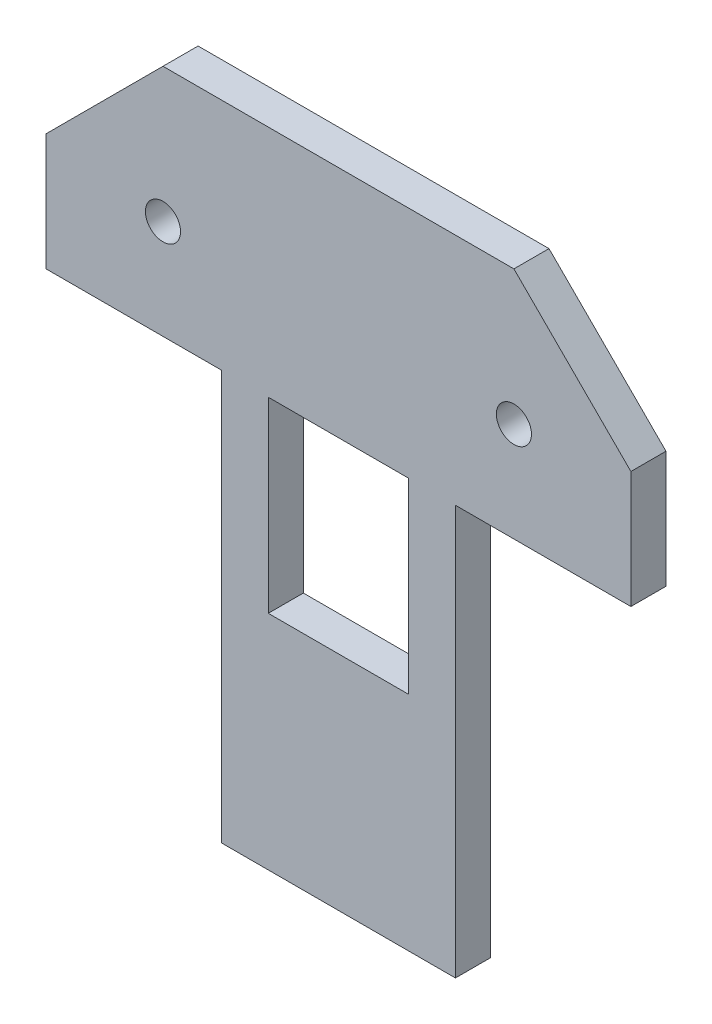
ISO-10303-21;
HEADER;
FILE_DESCRIPTION(('STEP AP214'),'2;1');
FILE_NAME('part.step','',(''),(''),'','','');
FILE_SCHEMA(('AUTOMOTIVE_DESIGN { 1 0 10303 214 1 1 1 1 }'));
ENDSEC;
DATA;
#1=APPLICATION_CONTEXT('core data for automotive mechanical design processes');
#2=APPLICATION_PROTOCOL_DEFINITION('international standard','automotive_design',2000,#1);
#3=PRODUCT_CONTEXT('',#1,'mechanical');
#4=PRODUCT('Part','Part','',(#3));
#5=PRODUCT_RELATED_PRODUCT_CATEGORY('part','',(#4));
#6=PRODUCT_DEFINITION_FORMATION('','',#4);
#7=PRODUCT_DEFINITION_CONTEXT('part definition',#1,'design');
#8=PRODUCT_DEFINITION('design','',#6,#7);
#9=PRODUCT_DEFINITION_SHAPE('','',#8);
#10=(LENGTH_UNIT() NAMED_UNIT(*) SI_UNIT(.MILLI.,.METRE.));
#11=(NAMED_UNIT(*) PLANE_ANGLE_UNIT() SI_UNIT($,.RADIAN.));
#12=(NAMED_UNIT(*) SI_UNIT($,.STERADIAN.) SOLID_ANGLE_UNIT());
#13=UNCERTAINTY_MEASURE_WITH_UNIT(LENGTH_MEASURE(1.E-05),#10,'distance_accuracy_value','');
#14=(GEOMETRIC_REPRESENTATION_CONTEXT(3) GLOBAL_UNCERTAINTY_ASSIGNED_CONTEXT((#13)) GLOBAL_UNIT_ASSIGNED_CONTEXT((#10,
#11,#12)) REPRESENTATION_CONTEXT('',''));
#15=CARTESIAN_POINT('',(0.,0.,0.));
#16=DIRECTION('',(0.,0.,1.));
#17=DIRECTION('',(1.,0.,0.));
#18=AXIS2_PLACEMENT_3D('',#15,#16,#17);
#19=CARTESIAN_POINT('',(0.,0.,3.));
#20=DIRECTION('',(0.,0.,-1.));
#21=DIRECTION('',(-1.,0.,0.));
#22=AXIS2_PLACEMENT_3D('',#19,#20,#21);
#23=PLANE('',#22);
#24=CARTESIAN_POINT('',(15.,-1.5,3.));
#25=DIRECTION('',(0.,0.,1.));
#26=DIRECTION('',(1.,0.,0.));
#27=AXIS2_PLACEMENT_3D('',#24,#25,#26);
#28=CIRCLE('',#27,1.5);
#29=CARTESIAN_POINT('',(16.5,-1.5,3.));
#30=VERTEX_POINT('',#29);
#31=EDGE_CURVE('E169',#30,#30,#28,.T.);
#32=ORIENTED_EDGE('',*,*,#31,.F.);
#33=EDGE_LOOP('',(#32));
#34=FACE_BOUND('',#33,.T.);
#35=DIRECTION('',(0.,-1.,0.));
#36=VECTOR('',#35,1.);
#37=CARTESIAN_POINT('',(-25.,-10.,3.));
#38=LINE('',#37,#36);
#39=CARTESIAN_POINT('',(-25.,0.,3.));
#40=VERTEX_POINT('',#39);
#41=CARTESIAN_POINT('',(-25.,-10.,3.));
#42=VERTEX_POINT('',#41);
#43=EDGE_CURVE('E181',#40,#42,#38,.T.);
#44=ORIENTED_EDGE('',*,*,#43,.T.);
#45=DIRECTION('',(1.,0.,0.));
#46=VECTOR('',#45,1.);
#47=CARTESIAN_POINT('',(-25.,-10.,3.));
#48=LINE('',#47,#46);
#49=CARTESIAN_POINT('',(-9.99999999999999,-10.,3.));
#50=VERTEX_POINT('',#49);
#51=EDGE_CURVE('E184',#42,#50,#48,.T.);
#52=ORIENTED_EDGE('',*,*,#51,.T.);
#53=DIRECTION('',(0.,-1.,0.));
#54=VECTOR('',#53,1.);
#55=CARTESIAN_POINT('',(-9.99999999999999,-10.,3.));
#56=LINE('',#55,#54);
#57=CARTESIAN_POINT('',(-9.99999999999999,-45.,3.));
#58=VERTEX_POINT('',#57);
#59=EDGE_CURVE('E187',#50,#58,#56,.T.);
#60=ORIENTED_EDGE('',*,*,#59,.T.);
#61=DIRECTION('',(1.,0.,0.));
#62=VECTOR('',#61,1.);
#63=CARTESIAN_POINT('',(-9.99999999999999,-45.,3.));
#64=LINE('',#63,#62);
#65=CARTESIAN_POINT('',(10.,-45.,3.));
#66=VERTEX_POINT('',#65);
#67=EDGE_CURVE('E189',#58,#66,#64,.T.);
#68=ORIENTED_EDGE('',*,*,#67,.T.);
#69=DIRECTION('',(0.,1.,0.));
#70=VECTOR('',#69,1.);
#71=CARTESIAN_POINT('',(10.,-10.,3.));
#72=LINE('',#71,#70);
#73=CARTESIAN_POINT('',(10.,-10.,3.));
#74=VERTEX_POINT('',#73);
#75=EDGE_CURVE('E191',#66,#74,#72,.T.);
#76=ORIENTED_EDGE('',*,*,#75,.T.);
#77=DIRECTION('',(1.,0.,0.));
#78=VECTOR('',#77,1.);
#79=CARTESIAN_POINT('',(10.,-10.,3.));
#80=LINE('',#79,#78);
#81=CARTESIAN_POINT('',(25.,-10.,3.));
#82=VERTEX_POINT('',#81);
#83=EDGE_CURVE('E193',#74,#82,#80,.T.);
#84=ORIENTED_EDGE('',*,*,#83,.T.);
#85=DIRECTION('',(0.,1.,0.));
#86=VECTOR('',#85,1.);
#87=CARTESIAN_POINT('',(25.,-10.,3.));
#88=LINE('',#87,#86);
#89=CARTESIAN_POINT('',(25.,0.,3.));
#90=VERTEX_POINT('',#89);
#91=EDGE_CURVE('E195',#82,#90,#88,.T.);
#92=ORIENTED_EDGE('',*,*,#91,.T.);
#93=DIRECTION('',(-0.707106781186548,0.707106781186547,0.));
#94=VECTOR('',#93,1.);
#95=CARTESIAN_POINT('',(15.,10.,3.));
#96=LINE('',#95,#94);
#97=CARTESIAN_POINT('',(15.,10.,3.));
#98=VERTEX_POINT('',#97);
#99=EDGE_CURVE('E197',#90,#98,#96,.T.);
#100=ORIENTED_EDGE('',*,*,#99,.T.);
#101=DIRECTION('',(-1.,0.,0.));
#102=VECTOR('',#101,1.);
#103=CARTESIAN_POINT('',(-15.,10.,3.));
#104=LINE('',#103,#102);
#105=CARTESIAN_POINT('',(-15.,10.,3.));
#106=VERTEX_POINT('',#105);
#107=EDGE_CURVE('E199',#98,#106,#104,.T.);
#108=ORIENTED_EDGE('',*,*,#107,.T.);
#109=DIRECTION('',(-0.707106781186548,-0.707106781186547,0.));
#110=VECTOR('',#109,1.);
#111=CARTESIAN_POINT('',(-25.,0.,3.));
#112=LINE('',#111,#110);
#113=EDGE_CURVE('E201',#106,#40,#112,.T.);
#114=ORIENTED_EDGE('',*,*,#113,.T.);
#115=EDGE_LOOP('',(#44,#52,#60,#68,#76,#84,#92,#100,#108,#114));
#116=FACE_BOUND('',#115,.T.);
#117=CARTESIAN_POINT('',(-15.,-1.5,3.));
#118=DIRECTION('',(0.,0.,1.));
#119=DIRECTION('',(1.,0.,0.));
#120=AXIS2_PLACEMENT_3D('',#117,#118,#119);
#121=CIRCLE('',#120,1.5);
#122=CARTESIAN_POINT('',(-13.5,-1.5,3.));
#123=VERTEX_POINT('',#122);
#124=EDGE_CURVE('E175',#123,#123,#121,.T.);
#125=ORIENTED_EDGE('',*,*,#124,.F.);
#126=EDGE_LOOP('',(#125));
#127=FACE_BOUND('',#126,.T.);
#128=DIRECTION('',(0.,-1.,0.));
#129=VECTOR('',#128,1.);
#130=CARTESIAN_POINT('',(-5.99999999999999,-10.,3.));
#131=LINE('',#130,#129);
#132=CARTESIAN_POINT('',(-5.99999999999999,-10.,3.));
#133=VERTEX_POINT('',#132);
#134=CARTESIAN_POINT('',(-5.99999999999999,-26.,3.));
#135=VERTEX_POINT('',#134);
#136=EDGE_CURVE('E133',#133,#135,#131,.T.);
#137=ORIENTED_EDGE('',*,*,#136,.F.);
#138=DIRECTION('',(-1.,0.,0.));
#139=VECTOR('',#138,1.);
#140=CARTESIAN_POINT('',(-5.99999999999999,-10.,3.));
#141=LINE('',#140,#139);
#142=CARTESIAN_POINT('',(6.00000000000001,-10.,3.));
#143=VERTEX_POINT('',#142);
#144=EDGE_CURVE('E155',#143,#133,#141,.T.);
#145=ORIENTED_EDGE('',*,*,#144,.F.);
#146=DIRECTION('',(0.,1.,0.));
#147=VECTOR('',#146,1.);
#148=CARTESIAN_POINT('',(6.00000000000001,-10.,3.));
#149=LINE('',#148,#147);
#150=CARTESIAN_POINT('',(6.00000000000001,-26.,3.));
#151=VERTEX_POINT('',#150);
#152=EDGE_CURVE('E153',#151,#143,#149,.T.);
#153=ORIENTED_EDGE('',*,*,#152,.F.);
#154=DIRECTION('',(1.,0.,0.));
#155=VECTOR('',#154,1.);
#156=CARTESIAN_POINT('',(-5.99999999999999,-26.,3.));
#157=LINE('',#156,#155);
#158=EDGE_CURVE('E141',#135,#151,#157,.T.);
#159=ORIENTED_EDGE('',*,*,#158,.F.);
#160=EDGE_LOOP('',(#137,#145,#153,#159));
#161=FACE_BOUND('',#160,.T.);
#162=ADVANCED_FACE('F32',(#34,#116,#127,#161),#23,.F.);
#163=CARTESIAN_POINT('',(0.,0.,0.));
#164=DIRECTION('',(0.,0.,-1.));
#165=DIRECTION('',(-1.,0.,0.));
#166=AXIS2_PLACEMENT_3D('',#163,#164,#165);
#167=PLANE('',#166);
#168=CARTESIAN_POINT('',(15.,-1.5,0.));
#169=DIRECTION('',(0.,0.,1.));
#170=DIRECTION('',(1.,0.,0.));
#171=AXIS2_PLACEMENT_3D('',#168,#169,#170);
#172=CIRCLE('',#171,1.5);
#173=CARTESIAN_POINT('',(16.5,-1.5,0.));
#174=VERTEX_POINT('',#173);
#175=EDGE_CURVE('E149',#174,#174,#172,.T.);
#176=ORIENTED_EDGE('',*,*,#175,.T.);
#177=EDGE_LOOP('',(#176));
#178=FACE_BOUND('',#177,.T.);
#179=DIRECTION('',(0.,-1.,0.));
#180=VECTOR('',#179,1.);
#181=CARTESIAN_POINT('',(-25.,-10.,0.));
#182=LINE('',#181,#180);
#183=CARTESIAN_POINT('',(-25.,0.,0.));
#184=VERTEX_POINT('',#183);
#185=CARTESIAN_POINT('',(-25.,-10.,0.));
#186=VERTEX_POINT('',#185);
#187=EDGE_CURVE('E178',#184,#186,#182,.T.);
#188=ORIENTED_EDGE('',*,*,#187,.F.);
#189=DIRECTION('',(-0.707106781186548,-0.707106781186547,0.));
#190=VECTOR('',#189,1.);
#191=CARTESIAN_POINT('',(-25.,0.,0.));
#192=LINE('',#191,#190);
#193=CARTESIAN_POINT('',(-15.,10.,0.));
#194=VERTEX_POINT('',#193);
#195=EDGE_CURVE('E185',#194,#184,#192,.T.);
#196=ORIENTED_EDGE('',*,*,#195,.F.);
#197=DIRECTION('',(-1.,0.,0.));
#198=VECTOR('',#197,1.);
#199=CARTESIAN_POINT('',(-15.,10.,0.));
#200=LINE('',#199,#198);
#201=CARTESIAN_POINT('',(15.,10.,0.));
#202=VERTEX_POINT('',#201);
#203=EDGE_CURVE('E220',#202,#194,#200,.T.);
#204=ORIENTED_EDGE('',*,*,#203,.F.);
#205=DIRECTION('',(-0.707106781186548,0.707106781186547,0.));
#206=VECTOR('',#205,1.);
#207=CARTESIAN_POINT('',(15.,10.,0.));
#208=LINE('',#207,#206);
#209=CARTESIAN_POINT('',(25.,0.,0.));
#210=VERTEX_POINT('',#209);
#211=EDGE_CURVE('E218',#210,#202,#208,.T.);
#212=ORIENTED_EDGE('',*,*,#211,.F.);
#213=DIRECTION('',(0.,1.,0.));
#214=VECTOR('',#213,1.);
#215=CARTESIAN_POINT('',(25.,-10.,0.));
#216=LINE('',#215,#214);
#217=CARTESIAN_POINT('',(25.,-10.,0.));
#218=VERTEX_POINT('',#217);
#219=EDGE_CURVE('E216',#218,#210,#216,.T.);
#220=ORIENTED_EDGE('',*,*,#219,.F.);
#221=DIRECTION('',(1.,0.,0.));
#222=VECTOR('',#221,1.);
#223=CARTESIAN_POINT('',(10.,-10.,0.));
#224=LINE('',#223,#222);
#225=CARTESIAN_POINT('',(10.,-10.,0.));
#226=VERTEX_POINT('',#225);
#227=EDGE_CURVE('E214',#226,#218,#224,.T.);
#228=ORIENTED_EDGE('',*,*,#227,.F.);
#229=DIRECTION('',(0.,1.,0.));
#230=VECTOR('',#229,1.);
#231=CARTESIAN_POINT('',(10.,-10.,0.));
#232=LINE('',#231,#230);
#233=CARTESIAN_POINT('',(10.,-45.,0.));
#234=VERTEX_POINT('',#233);
#235=EDGE_CURVE('E212',#234,#226,#232,.T.);
#236=ORIENTED_EDGE('',*,*,#235,.F.);
#237=DIRECTION('',(1.,0.,0.));
#238=VECTOR('',#237,1.);
#239=CARTESIAN_POINT('',(-9.99999999999999,-45.,0.));
#240=LINE('',#239,#238);
#241=CARTESIAN_POINT('',(-9.99999999999999,-45.,0.));
#242=VERTEX_POINT('',#241);
#243=EDGE_CURVE('E210',#242,#234,#240,.T.);
#244=ORIENTED_EDGE('',*,*,#243,.F.);
#245=DIRECTION('',(0.,-1.,0.));
#246=VECTOR('',#245,1.);
#247=CARTESIAN_POINT('',(-9.99999999999999,-10.,0.));
#248=LINE('',#247,#246);
#249=CARTESIAN_POINT('',(-9.99999999999999,-10.,0.));
#250=VERTEX_POINT('',#249);
#251=EDGE_CURVE('E208',#250,#242,#248,.T.);
#252=ORIENTED_EDGE('',*,*,#251,.F.);
#253=DIRECTION('',(1.,0.,0.));
#254=VECTOR('',#253,1.);
#255=CARTESIAN_POINT('',(-25.,-10.,0.));
#256=LINE('',#255,#254);
#257=EDGE_CURVE('E206',#186,#250,#256,.T.);
#258=ORIENTED_EDGE('',*,*,#257,.F.);
#259=EDGE_LOOP('',(#188,#196,#204,#212,#220,#228,#236,#244,#252,#258));
#260=FACE_BOUND('',#259,.T.);
#261=CARTESIAN_POINT('',(-15.,-1.5,0.));
#262=DIRECTION('',(0.,0.,1.));
#263=DIRECTION('',(1.,0.,0.));
#264=AXIS2_PLACEMENT_3D('',#261,#262,#263);
#265=CIRCLE('',#264,1.5);
#266=CARTESIAN_POINT('',(-13.5,-1.5,0.));
#267=VERTEX_POINT('',#266);
#268=EDGE_CURVE('E172',#267,#267,#265,.T.);
#269=ORIENTED_EDGE('',*,*,#268,.T.);
#270=EDGE_LOOP('',(#269));
#271=FACE_BOUND('',#270,.T.);
#272=DIRECTION('',(-1.,0.,0.));
#273=VECTOR('',#272,1.);
#274=CARTESIAN_POINT('',(-5.99999999999999,-10.,0.));
#275=LINE('',#274,#273);
#276=CARTESIAN_POINT('',(6.00000000000001,-10.,0.));
#277=VERTEX_POINT('',#276);
#278=CARTESIAN_POINT('',(-5.99999999999999,-10.,0.));
#279=VERTEX_POINT('',#278);
#280=EDGE_CURVE('E142',#277,#279,#275,.T.);
#281=ORIENTED_EDGE('',*,*,#280,.T.);
#282=DIRECTION('',(0.,-1.,0.));
#283=VECTOR('',#282,1.);
#284=CARTESIAN_POINT('',(-5.99999999999999,-10.,0.));
#285=LINE('',#284,#283);
#286=CARTESIAN_POINT('',(-5.99999999999999,-26.,0.));
#287=VERTEX_POINT('',#286);
#288=EDGE_CURVE('E55',#279,#287,#285,.T.);
#289=ORIENTED_EDGE('',*,*,#288,.T.);
#290=DIRECTION('',(1.,0.,0.));
#291=VECTOR('',#290,1.);
#292=CARTESIAN_POINT('',(-5.99999999999999,-26.,0.));
#293=LINE('',#292,#291);
#294=CARTESIAN_POINT('',(6.00000000000001,-26.,0.));
#295=VERTEX_POINT('',#294);
#296=EDGE_CURVE('E148',#287,#295,#293,.T.);
#297=ORIENTED_EDGE('',*,*,#296,.T.);
#298=DIRECTION('',(0.,1.,0.));
#299=VECTOR('',#298,1.);
#300=CARTESIAN_POINT('',(6.00000000000001,-10.,0.));
#301=LINE('',#300,#299);
#302=EDGE_CURVE('E161',#295,#277,#301,.T.);
#303=ORIENTED_EDGE('',*,*,#302,.T.);
#304=EDGE_LOOP('',(#281,#289,#297,#303));
#305=FACE_BOUND('',#304,.T.);
#306=ADVANCED_FACE('F256',(#178,#260,#271,#305),#167,.T.);
#307=CARTESIAN_POINT('',(-25.,-10.,3.));
#308=DIRECTION('',(1.,0.,0.));
#309=DIRECTION('',(0.,0.,-1.));
#310=AXIS2_PLACEMENT_3D('',#307,#308,#309);
#311=PLANE('',#310);
#312=ORIENTED_EDGE('',*,*,#187,.T.);
#313=DIRECTION('',(0.,0.,-1.));
#314=VECTOR('',#313,1.);
#315=CARTESIAN_POINT('',(-25.,-10.,3.));
#316=LINE('',#315,#314);
#317=EDGE_CURVE('E11',#42,#186,#316,.T.);
#318=ORIENTED_EDGE('',*,*,#317,.F.);
#319=ORIENTED_EDGE('',*,*,#43,.F.);
#320=DIRECTION('',(0.,0.,-1.));
#321=VECTOR('',#320,1.);
#322=CARTESIAN_POINT('',(-25.,0.,3.));
#323=LINE('',#322,#321);
#324=EDGE_CURVE('E203',#40,#184,#323,.T.);
#325=ORIENTED_EDGE('',*,*,#324,.T.);
#326=EDGE_LOOP('',(#312,#318,#319,#325));
#327=FACE_BOUND('',#326,.T.);
#328=ADVANCED_FACE('F34',(#327),#311,.F.);
#329=CARTESIAN_POINT('',(-25.,-10.,3.));
#330=DIRECTION('',(0.,1.,0.));
#331=DIRECTION('',(0.,0.,1.));
#332=AXIS2_PLACEMENT_3D('',#329,#330,#331);
#333=PLANE('',#332);
#334=ORIENTED_EDGE('',*,*,#257,.T.);
#335=DIRECTION('',(0.,0.,-1.));
#336=VECTOR('',#335,1.);
#337=CARTESIAN_POINT('',(-9.99999999999999,-10.,3.));
#338=LINE('',#337,#336);
#339=EDGE_CURVE('E40',#50,#250,#338,.T.);
#340=ORIENTED_EDGE('',*,*,#339,.F.);
#341=ORIENTED_EDGE('',*,*,#51,.F.);
#342=ORIENTED_EDGE('',*,*,#317,.T.);
#343=EDGE_LOOP('',(#334,#340,#341,#342));
#344=FACE_BOUND('',#343,.T.);
#345=ADVANCED_FACE('F274',(#344),#333,.F.);
#346=CARTESIAN_POINT('',(-9.99999999999999,-10.,3.));
#347=DIRECTION('',(1.,0.,0.));
#348=DIRECTION('',(0.,1.,0.));
#349=AXIS2_PLACEMENT_3D('',#346,#347,#348);
#350=PLANE('',#349);
#351=ORIENTED_EDGE('',*,*,#251,.T.);
#352=DIRECTION('',(0.,0.,-1.));
#353=VECTOR('',#352,1.);
#354=CARTESIAN_POINT('',(-9.99999999999999,-45.,3.));
#355=LINE('',#354,#353);
#356=EDGE_CURVE('E243',#58,#242,#355,.T.);
#357=ORIENTED_EDGE('',*,*,#356,.F.);
#358=ORIENTED_EDGE('',*,*,#59,.F.);
#359=ORIENTED_EDGE('',*,*,#339,.T.);
#360=EDGE_LOOP('',(#351,#357,#358,#359));
#361=FACE_BOUND('',#360,.T.);
#362=ADVANCED_FACE('F250',(#361),#350,.F.);
#363=CARTESIAN_POINT('',(-9.99999999999999,-45.,3.));
#364=DIRECTION('',(0.,1.,0.));
#365=DIRECTION('',(0.,0.,1.));
#366=AXIS2_PLACEMENT_3D('',#363,#364,#365);
#367=PLANE('',#366);
#368=ORIENTED_EDGE('',*,*,#243,.T.);
#369=DIRECTION('',(0.,0.,-1.));
#370=VECTOR('',#369,1.);
#371=CARTESIAN_POINT('',(10.,-45.,3.));
#372=LINE('',#371,#370);
#373=EDGE_CURVE('E240',#66,#234,#372,.T.);
#374=ORIENTED_EDGE('',*,*,#373,.F.);
#375=ORIENTED_EDGE('',*,*,#67,.F.);
#376=ORIENTED_EDGE('',*,*,#356,.T.);
#377=EDGE_LOOP('',(#368,#374,#375,#376));
#378=FACE_BOUND('',#377,.T.);
#379=ADVANCED_FACE('F262',(#378),#367,.F.);
#380=CARTESIAN_POINT('',(10.,-10.,3.));
#381=DIRECTION('',(-1.,0.,0.));
#382=DIRECTION('',(0.,-1.,0.));
#383=AXIS2_PLACEMENT_3D('',#380,#381,#382);
#384=PLANE('',#383);
#385=ORIENTED_EDGE('',*,*,#235,.T.);
#386=DIRECTION('',(0.,0.,-1.));
#387=VECTOR('',#386,1.);
#388=CARTESIAN_POINT('',(10.,-10.,3.));
#389=LINE('',#388,#387);
#390=EDGE_CURVE('E237',#74,#226,#389,.T.);
#391=ORIENTED_EDGE('',*,*,#390,.F.);
#392=ORIENTED_EDGE('',*,*,#75,.F.);
#393=ORIENTED_EDGE('',*,*,#373,.T.);
#394=EDGE_LOOP('',(#385,#391,#392,#393));
#395=FACE_BOUND('',#394,.T.);
#396=ADVANCED_FACE('F266',(#395),#384,.F.);
#397=CARTESIAN_POINT('',(10.,-10.,3.));
#398=DIRECTION('',(0.,1.,0.));
#399=DIRECTION('',(0.,0.,1.));
#400=AXIS2_PLACEMENT_3D('',#397,#398,#399);
#401=PLANE('',#400);
#402=ORIENTED_EDGE('',*,*,#227,.T.);
#403=DIRECTION('',(0.,0.,-1.));
#404=VECTOR('',#403,1.);
#405=CARTESIAN_POINT('',(25.,-10.,3.));
#406=LINE('',#405,#404);
#407=EDGE_CURVE('E234',#82,#218,#406,.T.);
#408=ORIENTED_EDGE('',*,*,#407,.F.);
#409=ORIENTED_EDGE('',*,*,#83,.F.);
#410=ORIENTED_EDGE('',*,*,#390,.T.);
#411=EDGE_LOOP('',(#402,#408,#409,#410));
#412=FACE_BOUND('',#411,.T.);
#413=ADVANCED_FACE('F297',(#412),#401,.F.);
#414=CARTESIAN_POINT('',(25.,-10.,3.));
#415=DIRECTION('',(-1.,0.,0.));
#416=DIRECTION('',(0.,0.,1.));
#417=AXIS2_PLACEMENT_3D('',#414,#415,#416);
#418=PLANE('',#417);
#419=ORIENTED_EDGE('',*,*,#219,.T.);
#420=DIRECTION('',(0.,0.,-1.));
#421=VECTOR('',#420,1.);
#422=CARTESIAN_POINT('',(25.,0.,3.));
#423=LINE('',#422,#421);
#424=EDGE_CURVE('E231',#90,#210,#423,.T.);
#425=ORIENTED_EDGE('',*,*,#424,.F.);
#426=ORIENTED_EDGE('',*,*,#91,.F.);
#427=ORIENTED_EDGE('',*,*,#407,.T.);
#428=EDGE_LOOP('',(#419,#425,#426,#427));
#429=FACE_BOUND('',#428,.T.);
#430=ADVANCED_FACE('F294',(#429),#418,.F.);
#431=CARTESIAN_POINT('',(15.,10.,3.));
#432=DIRECTION('',(-0.707106781186547,-0.707106781186548,0.));
#433=DIRECTION('',(0.707106781186548,-0.707106781186547,0.));
#434=AXIS2_PLACEMENT_3D('',#431,#432,#433);
#435=PLANE('',#434);
#436=ORIENTED_EDGE('',*,*,#211,.T.);
#437=DIRECTION('',(0.,0.,-1.));
#438=VECTOR('',#437,1.);
#439=CARTESIAN_POINT('',(15.,10.,3.));
#440=LINE('',#439,#438);
#441=EDGE_CURVE('E228',#98,#202,#440,.T.);
#442=ORIENTED_EDGE('',*,*,#441,.F.);
#443=ORIENTED_EDGE('',*,*,#99,.F.);
#444=ORIENTED_EDGE('',*,*,#424,.T.);
#445=EDGE_LOOP('',(#436,#442,#443,#444));
#446=FACE_BOUND('',#445,.T.);
#447=ADVANCED_FACE('F290',(#446),#435,.F.);
#448=CARTESIAN_POINT('',(-15.,10.,3.));
#449=DIRECTION('',(0.,-1.,0.));
#450=DIRECTION('',(0.,0.,-1.));
#451=AXIS2_PLACEMENT_3D('',#448,#449,#450);
#452=PLANE('',#451);
#453=ORIENTED_EDGE('',*,*,#203,.T.);
#454=DIRECTION('',(0.,0.,-1.));
#455=VECTOR('',#454,1.);
#456=CARTESIAN_POINT('',(-15.,10.,3.));
#457=LINE('',#456,#455);
#458=EDGE_CURVE('E225',#106,#194,#457,.T.);
#459=ORIENTED_EDGE('',*,*,#458,.F.);
#460=ORIENTED_EDGE('',*,*,#107,.F.);
#461=ORIENTED_EDGE('',*,*,#441,.T.);
#462=EDGE_LOOP('',(#453,#459,#460,#461));
#463=FACE_BOUND('',#462,.T.);
#464=ADVANCED_FACE('F286',(#463),#452,.F.);
#465=CARTESIAN_POINT('',(-25.,0.,3.));
#466=DIRECTION('',(0.707106781186547,-0.707106781186548,0.));
#467=DIRECTION('',(0.707106781186548,0.707106781186547,0.));
#468=AXIS2_PLACEMENT_3D('',#465,#466,#467);
#469=PLANE('',#468);
#470=ORIENTED_EDGE('',*,*,#195,.T.);
#471=ORIENTED_EDGE('',*,*,#324,.F.);
#472=ORIENTED_EDGE('',*,*,#113,.F.);
#473=ORIENTED_EDGE('',*,*,#458,.T.);
#474=EDGE_LOOP('',(#470,#471,#472,#473));
#475=FACE_BOUND('',#474,.T.);
#476=ADVANCED_FACE('F281',(#475),#469,.F.);
#477=CARTESIAN_POINT('',(-15.,-1.5,3.));
#478=DIRECTION('',(0.,0.,-1.));
#479=DIRECTION('',(-1.,0.,0.));
#480=AXIS2_PLACEMENT_3D('',#477,#478,#479);
#481=CYLINDRICAL_SURFACE('',#480,1.5);
#482=ORIENTED_EDGE('',*,*,#124,.T.);
#483=EDGE_LOOP('',(#482));
#484=FACE_BOUND('',#483,.T.);
#485=ORIENTED_EDGE('',*,*,#268,.F.);
#486=EDGE_LOOP('',(#485));
#487=FACE_BOUND('',#486,.T.);
#488=ADVANCED_FACE('F316',(#484,#487),#481,.F.);
#489=CARTESIAN_POINT('',(15.,-1.5,3.));
#490=DIRECTION('',(0.,0.,-1.));
#491=DIRECTION('',(-1.,0.,0.));
#492=AXIS2_PLACEMENT_3D('',#489,#490,#491);
#493=CYLINDRICAL_SURFACE('',#492,1.5);
#494=ORIENTED_EDGE('',*,*,#31,.T.);
#495=EDGE_LOOP('',(#494));
#496=FACE_BOUND('',#495,.T.);
#497=ORIENTED_EDGE('',*,*,#175,.F.);
#498=EDGE_LOOP('',(#497));
#499=FACE_BOUND('',#498,.T.);
#500=ADVANCED_FACE('F342',(#496,#499),#493,.F.);
#501=CARTESIAN_POINT('',(-5.99999999999999,-10.,3.));
#502=DIRECTION('',(1.,0.,0.));
#503=DIRECTION('',(0.,1.,0.));
#504=AXIS2_PLACEMENT_3D('',#501,#502,#503);
#505=PLANE('',#504);
#506=ORIENTED_EDGE('',*,*,#288,.F.);
#507=DIRECTION('',(0.,0.,-1.));
#508=VECTOR('',#507,1.);
#509=CARTESIAN_POINT('',(-5.99999999999999,-10.,3.));
#510=LINE('',#509,#508);
#511=EDGE_CURVE('E137',#133,#279,#510,.T.);
#512=ORIENTED_EDGE('',*,*,#511,.F.);
#513=ORIENTED_EDGE('',*,*,#136,.T.);
#514=DIRECTION('',(0.,0.,-1.));
#515=VECTOR('',#514,1.);
#516=CARTESIAN_POINT('',(-5.99999999999999,-26.,3.));
#517=LINE('',#516,#515);
#518=EDGE_CURVE('E136',#135,#287,#517,.T.);
#519=ORIENTED_EDGE('',*,*,#518,.T.);
#520=EDGE_LOOP('',(#506,#512,#513,#519));
#521=FACE_BOUND('',#520,.T.);
#522=ADVANCED_FACE('F135',(#521),#505,.T.);
#523=CARTESIAN_POINT('',(-5.99999999999999,-26.,3.));
#524=DIRECTION('',(0.,1.,0.));
#525=DIRECTION('',(0.,0.,1.));
#526=AXIS2_PLACEMENT_3D('',#523,#524,#525);
#527=PLANE('',#526);
#528=ORIENTED_EDGE('',*,*,#296,.F.);
#529=ORIENTED_EDGE('',*,*,#518,.F.);
#530=ORIENTED_EDGE('',*,*,#158,.T.);
#531=DIRECTION('',(0.,0.,-1.));
#532=VECTOR('',#531,1.);
#533=CARTESIAN_POINT('',(6.00000000000001,-26.,3.));
#534=LINE('',#533,#532);
#535=EDGE_CURVE('E150',#151,#295,#534,.T.);
#536=ORIENTED_EDGE('',*,*,#535,.T.);
#537=EDGE_LOOP('',(#528,#529,#530,#536));
#538=FACE_BOUND('',#537,.T.);
#539=ADVANCED_FACE('F145',(#538),#527,.T.);
#540=CARTESIAN_POINT('',(6.00000000000001,-10.,3.));
#541=DIRECTION('',(-1.,0.,0.));
#542=DIRECTION('',(0.,-1.,0.));
#543=AXIS2_PLACEMENT_3D('',#540,#541,#542);
#544=PLANE('',#543);
#545=ORIENTED_EDGE('',*,*,#302,.F.);
#546=ORIENTED_EDGE('',*,*,#535,.F.);
#547=ORIENTED_EDGE('',*,*,#152,.T.);
#548=DIRECTION('',(0.,0.,-1.));
#549=VECTOR('',#548,1.);
#550=CARTESIAN_POINT('',(6.00000000000001,-10.,3.));
#551=LINE('',#550,#549);
#552=EDGE_CURVE('E47',#143,#277,#551,.T.);
#553=ORIENTED_EDGE('',*,*,#552,.T.);
#554=EDGE_LOOP('',(#545,#546,#547,#553));
#555=FACE_BOUND('',#554,.T.);
#556=ADVANCED_FACE('F361',(#555),#544,.T.);
#557=CARTESIAN_POINT('',(-5.99999999999999,-10.,3.));
#558=DIRECTION('',(0.,-1.,0.));
#559=DIRECTION('',(0.,0.,-1.));
#560=AXIS2_PLACEMENT_3D('',#557,#558,#559);
#561=PLANE('',#560);
#562=ORIENTED_EDGE('',*,*,#280,.F.);
#563=ORIENTED_EDGE('',*,*,#552,.F.);
#564=ORIENTED_EDGE('',*,*,#144,.T.);
#565=ORIENTED_EDGE('',*,*,#511,.T.);
#566=EDGE_LOOP('',(#562,#563,#564,#565));
#567=FACE_BOUND('',#566,.T.);
#568=ADVANCED_FACE('F368',(#567),#561,.T.);
#569=CLOSED_SHELL('',(#162,#306,#328,#345,#362,#379,#396,#413,#430,#447,#464,#476,#488,#500,
#522,#539,#556,#568));
#570=MANIFOLD_SOLID_BREP('B2',#569);
#571=ADVANCED_BREP_SHAPE_REPRESENTATION('',(#18,#570),#14);
#572=SHAPE_DEFINITION_REPRESENTATION(#9,#571);
ENDSEC;
END-ISO-10303-21;
